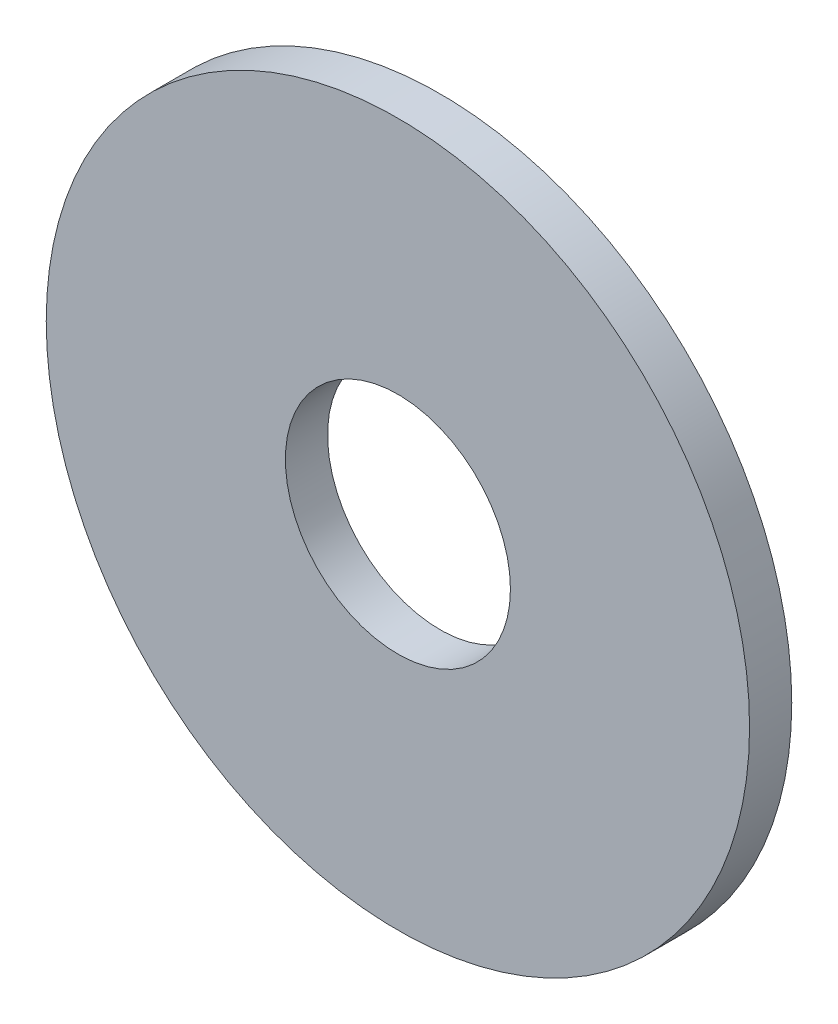
ISO-10303-21;
HEADER;
FILE_DESCRIPTION(('STEP AP214'),'2;1');
FILE_NAME('part.step','',(''),(''),'','','');
FILE_SCHEMA(('AUTOMOTIVE_DESIGN { 1 0 10303 214 1 1 1 1 }'));
ENDSEC;
DATA;
#1=APPLICATION_CONTEXT('core data for automotive mechanical design processes');
#2=APPLICATION_PROTOCOL_DEFINITION('international standard','automotive_design',2000,#1);
#3=PRODUCT_CONTEXT('',#1,'mechanical');
#4=PRODUCT('Part','Part','',(#3));
#5=PRODUCT_RELATED_PRODUCT_CATEGORY('part','',(#4));
#6=PRODUCT_DEFINITION_FORMATION('','',#4);
#7=PRODUCT_DEFINITION_CONTEXT('part definition',#1,'design');
#8=PRODUCT_DEFINITION('design','',#6,#7);
#9=PRODUCT_DEFINITION_SHAPE('','',#8);
#10=(LENGTH_UNIT() NAMED_UNIT(*) SI_UNIT(.MILLI.,.METRE.));
#11=(NAMED_UNIT(*) PLANE_ANGLE_UNIT() SI_UNIT($,.RADIAN.));
#12=(NAMED_UNIT(*) SI_UNIT($,.STERADIAN.) SOLID_ANGLE_UNIT());
#13=UNCERTAINTY_MEASURE_WITH_UNIT(LENGTH_MEASURE(1.E-05),#10,'distance_accuracy_value','');
#14=(GEOMETRIC_REPRESENTATION_CONTEXT(3) GLOBAL_UNCERTAINTY_ASSIGNED_CONTEXT((#13)) GLOBAL_UNIT_ASSIGNED_CONTEXT((#10,
#11,#12)) REPRESENTATION_CONTEXT('',''));
#15=CARTESIAN_POINT('',(0.,0.,0.));
#16=DIRECTION('',(0.,0.,1.));
#17=DIRECTION('',(1.,0.,0.));
#18=AXIS2_PLACEMENT_3D('',#15,#16,#17);
#19=CARTESIAN_POINT('',(0.,0.,1.5));
#20=DIRECTION('',(0.,0.,1.));
#21=DIRECTION('',(1.,0.,0.));
#22=AXIS2_PLACEMENT_3D('',#19,#20,#21);
#23=PLANE('',#22);
#24=CARTESIAN_POINT('',(0.,0.,1.5));
#25=DIRECTION('',(0.,0.,1.));
#26=DIRECTION('',(1.,0.,0.));
#27=AXIS2_PLACEMENT_3D('',#24,#25,#26);
#28=CIRCLE('',#27,12.5);
#29=CARTESIAN_POINT('',(12.5,0.,1.5));
#30=VERTEX_POINT('',#29);
#31=EDGE_CURVE('E10',#30,#30,#28,.T.);
#32=ORIENTED_EDGE('',*,*,#31,.T.);
#33=EDGE_LOOP('',(#32));
#34=FACE_BOUND('',#33,.T.);
#35=CARTESIAN_POINT('',(0.,0.,1.5));
#36=DIRECTION('',(0.,0.,1.));
#37=DIRECTION('',(1.,0.,0.));
#38=AXIS2_PLACEMENT_3D('',#35,#36,#37);
#39=CIRCLE('',#38,4.);
#40=CARTESIAN_POINT('',(4.,0.,1.5));
#41=VERTEX_POINT('',#40);
#42=EDGE_CURVE('E40',#41,#41,#39,.T.);
#43=ORIENTED_EDGE('',*,*,#42,.F.);
#44=EDGE_LOOP('',(#43));
#45=FACE_BOUND('',#44,.T.);
#46=ADVANCED_FACE('F29',(#34,#45),#23,.T.);
#47=CARTESIAN_POINT('',(0.,0.,0.));
#48=DIRECTION('',(0.,0.,1.));
#49=DIRECTION('',(1.,0.,0.));
#50=AXIS2_PLACEMENT_3D('',#47,#48,#49);
#51=PLANE('',#50);
#52=CARTESIAN_POINT('',(0.,0.,0.));
#53=DIRECTION('',(0.,0.,1.));
#54=DIRECTION('',(1.,0.,0.));
#55=AXIS2_PLACEMENT_3D('',#52,#53,#54);
#56=CIRCLE('',#55,12.5);
#57=CARTESIAN_POINT('',(12.5,0.,0.));
#58=VERTEX_POINT('',#57);
#59=EDGE_CURVE('E33',#58,#58,#56,.T.);
#60=ORIENTED_EDGE('',*,*,#59,.F.);
#61=EDGE_LOOP('',(#60));
#62=FACE_BOUND('',#61,.T.);
#63=CARTESIAN_POINT('',(0.,0.,0.));
#64=DIRECTION('',(0.,0.,1.));
#65=DIRECTION('',(1.,0.,0.));
#66=AXIS2_PLACEMENT_3D('',#63,#64,#65);
#67=CIRCLE('',#66,4.);
#68=CARTESIAN_POINT('',(4.,0.,0.));
#69=VERTEX_POINT('',#68);
#70=EDGE_CURVE('E42',#69,#69,#67,.T.);
#71=ORIENTED_EDGE('',*,*,#70,.T.);
#72=EDGE_LOOP('',(#71));
#73=FACE_BOUND('',#72,.T.);
#74=ADVANCED_FACE('F52',(#62,#73),#51,.F.);
#75=CARTESIAN_POINT('',(0.,0.,1.5));
#76=DIRECTION('',(0.,0.,-1.));
#77=DIRECTION('',(-1.,0.,0.));
#78=AXIS2_PLACEMENT_3D('',#75,#76,#77);
#79=CYLINDRICAL_SURFACE('',#78,12.5);
#80=ORIENTED_EDGE('',*,*,#31,.F.);
#81=EDGE_LOOP('',(#80));
#82=FACE_BOUND('',#81,.T.);
#83=ORIENTED_EDGE('',*,*,#59,.T.);
#84=EDGE_LOOP('',(#83));
#85=FACE_BOUND('',#84,.T.);
#86=ADVANCED_FACE('F31',(#82,#85),#79,.T.);
#87=CARTESIAN_POINT('',(0.,0.,1.5));
#88=DIRECTION('',(0.,0.,-1.));
#89=DIRECTION('',(-1.,0.,0.));
#90=AXIS2_PLACEMENT_3D('',#87,#88,#89);
#91=CYLINDRICAL_SURFACE('',#90,4.);
#92=ORIENTED_EDGE('',*,*,#42,.T.);
#93=EDGE_LOOP('',(#92));
#94=FACE_BOUND('',#93,.T.);
#95=ORIENTED_EDGE('',*,*,#70,.F.);
#96=EDGE_LOOP('',(#95));
#97=FACE_BOUND('',#96,.T.);
#98=ADVANCED_FACE('F48',(#94,#97),#91,.F.);
#99=CLOSED_SHELL('',(#46,#74,#86,#98));
#100=MANIFOLD_SOLID_BREP('B2',#99);
#101=ADVANCED_BREP_SHAPE_REPRESENTATION('',(#18,#100),#14);
#102=SHAPE_DEFINITION_REPRESENTATION(#9,#101);
ENDSEC;
END-ISO-10303-21;
